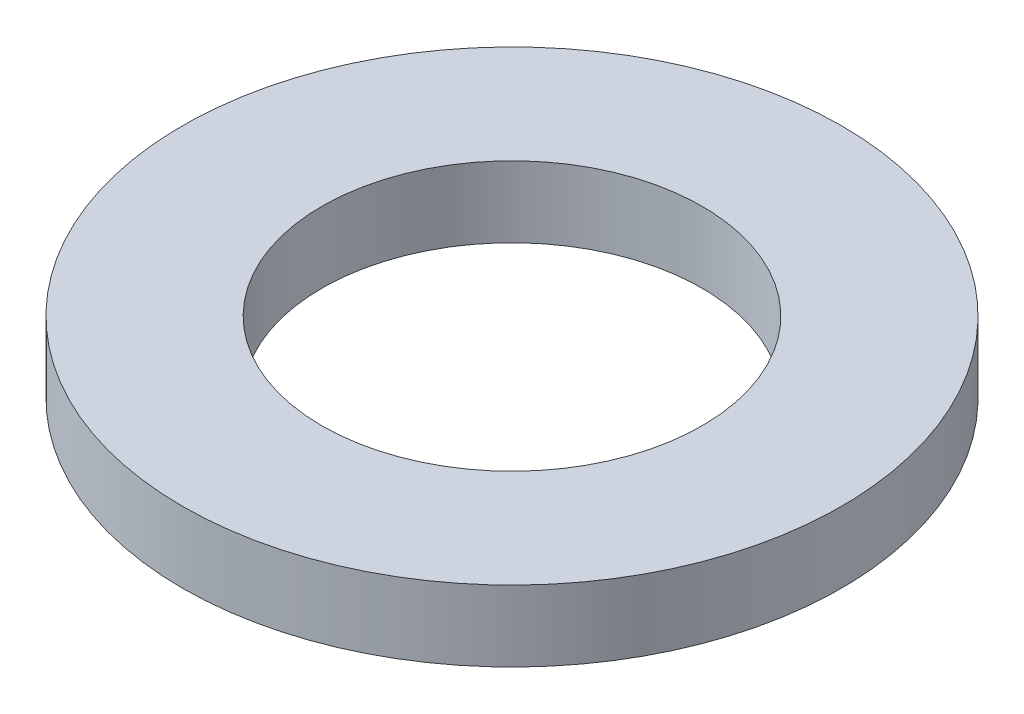
ISO-10303-21;
HEADER;
FILE_DESCRIPTION(('STEP AP214'),'2;1');
FILE_NAME('part.step','',(''),(''),'','','');
FILE_SCHEMA(('AUTOMOTIVE_DESIGN { 1 0 10303 214 1 1 1 1 }'));
ENDSEC;
DATA;
#1=APPLICATION_CONTEXT('core data for automotive mechanical design processes');
#2=APPLICATION_PROTOCOL_DEFINITION('international standard','automotive_design',2000,#1);
#3=PRODUCT_CONTEXT('',#1,'mechanical');
#4=PRODUCT('Part','Part','',(#3));
#5=PRODUCT_RELATED_PRODUCT_CATEGORY('part','',(#4));
#6=PRODUCT_DEFINITION_FORMATION('','',#4);
#7=PRODUCT_DEFINITION_CONTEXT('part definition',#1,'design');
#8=PRODUCT_DEFINITION('design','',#6,#7);
#9=PRODUCT_DEFINITION_SHAPE('','',#8);
#10=(LENGTH_UNIT() NAMED_UNIT(*) SI_UNIT(.MILLI.,.METRE.));
#11=(NAMED_UNIT(*) PLANE_ANGLE_UNIT() SI_UNIT($,.RADIAN.));
#12=(NAMED_UNIT(*) SI_UNIT($,.STERADIAN.) SOLID_ANGLE_UNIT());
#13=UNCERTAINTY_MEASURE_WITH_UNIT(LENGTH_MEASURE(1.E-05),#10,'distance_accuracy_value','');
#14=(GEOMETRIC_REPRESENTATION_CONTEXT(3) GLOBAL_UNCERTAINTY_ASSIGNED_CONTEXT((#13)) GLOBAL_UNIT_ASSIGNED_CONTEXT((#10,
#11,#12)) REPRESENTATION_CONTEXT('',''));
#15=CARTESIAN_POINT('',(0.,0.,0.));
#16=DIRECTION('',(0.,0.,1.));
#17=DIRECTION('',(1.,0.,0.));
#18=AXIS2_PLACEMENT_3D('',#15,#16,#17);
#19=CARTESIAN_POINT('',(0.,1.778,0.));
#20=DIRECTION('',(0.,-1.,0.));
#21=DIRECTION('',(0.,0.,-1.));
#22=AXIS2_PLACEMENT_3D('',#19,#20,#21);
#23=CYLINDRICAL_SURFACE('',#22,8.255);
#24=CARTESIAN_POINT('',(0.,1.778,0.));
#25=DIRECTION('',(0.,1.,0.));
#26=DIRECTION('',(0.,0.,1.));
#27=AXIS2_PLACEMENT_3D('',#24,#25,#26);
#28=CIRCLE('',#27,8.255);
#29=CARTESIAN_POINT('',(0.,1.778,8.255));
#30=VERTEX_POINT('',#29);
#31=EDGE_CURVE('E10',#30,#30,#28,.T.);
#32=ORIENTED_EDGE('',*,*,#31,.F.);
#33=EDGE_LOOP('',(#32));
#34=FACE_BOUND('',#33,.T.);
#35=CARTESIAN_POINT('',(0.,0.,0.));
#36=DIRECTION('',(0.,1.,0.));
#37=DIRECTION('',(0.,0.,1.));
#38=AXIS2_PLACEMENT_3D('',#35,#36,#37);
#39=CIRCLE('',#38,8.255);
#40=CARTESIAN_POINT('',(0.,0.,8.255));
#41=VERTEX_POINT('',#40);
#42=EDGE_CURVE('E40',#41,#41,#39,.T.);
#43=ORIENTED_EDGE('',*,*,#42,.T.);
#44=EDGE_LOOP('',(#43));
#45=FACE_BOUND('',#44,.T.);
#46=ADVANCED_FACE('F37',(#34,#45),#23,.T.);
#47=CARTESIAN_POINT('',(0.,1.778,0.));
#48=DIRECTION('',(0.,1.,0.));
#49=DIRECTION('',(0.,0.,1.));
#50=AXIS2_PLACEMENT_3D('',#47,#48,#49);
#51=PLANE('',#50);
#52=CARTESIAN_POINT('',(0.,1.778,0.));
#53=DIRECTION('',(0.,1.,0.));
#54=DIRECTION('',(0.,0.,1.));
#55=AXIS2_PLACEMENT_3D('',#52,#53,#54);
#56=CIRCLE('',#55,4.7625);
#57=CARTESIAN_POINT('',(0.,1.778,4.7625));
#58=VERTEX_POINT('',#57);
#59=EDGE_CURVE('E54',#58,#58,#56,.T.);
#60=ORIENTED_EDGE('',*,*,#59,.F.);
#61=EDGE_LOOP('',(#60));
#62=FACE_BOUND('',#61,.T.);
#63=ORIENTED_EDGE('',*,*,#31,.T.);
#64=EDGE_LOOP('',(#63));
#65=FACE_BOUND('',#64,.T.);
#66=ADVANCED_FACE('F61',(#62,#65),#51,.T.);
#67=CARTESIAN_POINT('',(0.,0.,0.));
#68=DIRECTION('',(0.,1.,0.));
#69=DIRECTION('',(0.,0.,1.));
#70=AXIS2_PLACEMENT_3D('',#67,#68,#69);
#71=PLANE('',#70);
#72=CARTESIAN_POINT('',(0.,0.,0.));
#73=DIRECTION('',(0.,1.,0.));
#74=DIRECTION('',(0.,0.,1.));
#75=AXIS2_PLACEMENT_3D('',#72,#73,#74);
#76=CIRCLE('',#75,4.7625);
#77=CARTESIAN_POINT('',(0.,0.,4.7625));
#78=VERTEX_POINT('',#77);
#79=EDGE_CURVE('E49',#78,#78,#76,.F.);
#80=ORIENTED_EDGE('',*,*,#79,.F.);
#81=EDGE_LOOP('',(#80));
#82=FACE_BOUND('',#81,.T.);
#83=ORIENTED_EDGE('',*,*,#42,.F.);
#84=EDGE_LOOP('',(#83));
#85=FACE_BOUND('',#84,.T.);
#86=ADVANCED_FACE('F63',(#82,#85),#71,.F.);
#87=CARTESIAN_POINT('',(0.,-13.4703841816037,0.));
#88=DIRECTION('',(0.,1.,0.));
#89=DIRECTION('',(0.,0.,1.));
#90=AXIS2_PLACEMENT_3D('',#87,#88,#89);
#91=CYLINDRICAL_SURFACE('',#90,4.7625);
#92=ORIENTED_EDGE('',*,*,#79,.T.);
#93=EDGE_LOOP('',(#92));
#94=FACE_BOUND('',#93,.T.);
#95=ORIENTED_EDGE('',*,*,#59,.T.);
#96=EDGE_LOOP('',(#95));
#97=FACE_BOUND('',#96,.T.);
#98=ADVANCED_FACE('F59',(#94,#97),#91,.F.);
#99=CLOSED_SHELL('',(#46,#66,#86,#98));
#100=MANIFOLD_SOLID_BREP('B2',#99);
#101=ADVANCED_BREP_SHAPE_REPRESENTATION('',(#18,#100),#14);
#102=SHAPE_DEFINITION_REPRESENTATION(#9,#101);
ENDSEC;
END-ISO-10303-21;
